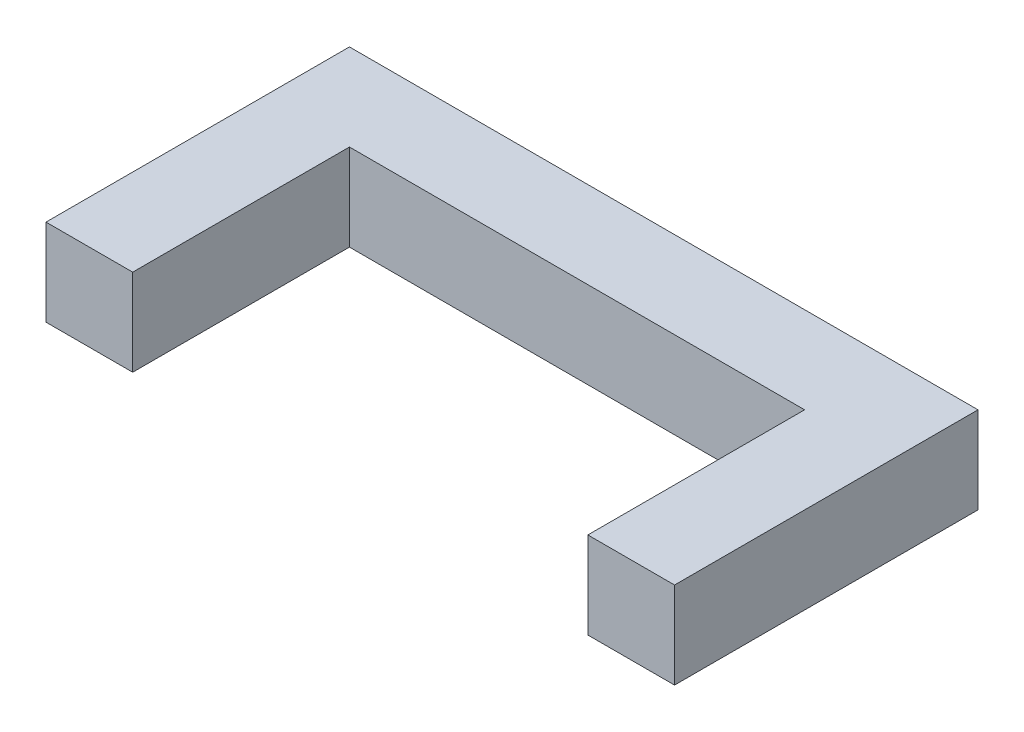
ISO-10303-21;
HEADER;
FILE_DESCRIPTION(('STEP AP214'),'2;1');
FILE_NAME('part.step','',(''),(''),'','','');
FILE_SCHEMA(('AUTOMOTIVE_DESIGN { 1 0 10303 214 1 1 1 1 }'));
ENDSEC;
DATA;
#1=APPLICATION_CONTEXT('core data for automotive mechanical design processes');
#2=APPLICATION_PROTOCOL_DEFINITION('international standard','automotive_design',2000,#1);
#3=PRODUCT_CONTEXT('',#1,'mechanical');
#4=PRODUCT('Part','Part','',(#3));
#5=PRODUCT_RELATED_PRODUCT_CATEGORY('part','',(#4));
#6=PRODUCT_DEFINITION_FORMATION('','',#4);
#7=PRODUCT_DEFINITION_CONTEXT('part definition',#1,'design');
#8=PRODUCT_DEFINITION('design','',#6,#7);
#9=PRODUCT_DEFINITION_SHAPE('','',#8);
#10=(LENGTH_UNIT() NAMED_UNIT(*) SI_UNIT(.MILLI.,.METRE.));
#11=(NAMED_UNIT(*) PLANE_ANGLE_UNIT() SI_UNIT($,.RADIAN.));
#12=(NAMED_UNIT(*) SI_UNIT($,.STERADIAN.) SOLID_ANGLE_UNIT());
#13=UNCERTAINTY_MEASURE_WITH_UNIT(LENGTH_MEASURE(1.E-05),#10,'distance_accuracy_value','');
#14=(GEOMETRIC_REPRESENTATION_CONTEXT(3) GLOBAL_UNCERTAINTY_ASSIGNED_CONTEXT((#13)) GLOBAL_UNIT_ASSIGNED_CONTEXT((#10,
#11,#12)) REPRESENTATION_CONTEXT('',''));
#15=CARTESIAN_POINT('',(0.,0.,0.));
#16=DIRECTION('',(0.,0.,1.));
#17=DIRECTION('',(1.,0.,0.));
#18=AXIS2_PLACEMENT_3D('',#15,#16,#17);
#19=CARTESIAN_POINT('',(0.,0.,-35.6));
#20=DIRECTION('',(0.,0.,-1.));
#21=DIRECTION('',(-1.,0.,0.));
#22=AXIS2_PLACEMENT_3D('',#19,#20,#21);
#23=PLANE('',#22);
#24=DIRECTION('',(-1.,0.,0.));
#25=VECTOR('',#24,1.);
#26=CARTESIAN_POINT('',(7.15964794267165,36.9181021954412,-35.6));
#27=LINE('',#26,#25);
#28=CARTESIAN_POINT('',(7.15964794267165,36.9181021954412,-35.6));
#29=VERTEX_POINT('',#28);
#30=CARTESIAN_POINT('',(5.15964794267165,36.9181021954412,-35.6));
#31=VERTEX_POINT('',#30);
#32=EDGE_CURVE('E156',#29,#31,#27,.T.);
#33=ORIENTED_EDGE('',*,*,#32,.F.);
#34=DIRECTION('',(0.,-1.,0.));
#35=VECTOR('',#34,1.);
#36=CARTESIAN_POINT('',(7.15964794267165,38.9181021954412,-35.6));
#37=LINE('',#36,#35);
#38=CARTESIAN_POINT('',(7.15964794267165,38.9181021954412,-35.6));
#39=VERTEX_POINT('',#38);
#40=EDGE_CURVE('E159',#39,#29,#37,.T.);
#41=ORIENTED_EDGE('',*,*,#40,.F.);
#42=DIRECTION('',(1.,0.,0.));
#43=VECTOR('',#42,1.);
#44=CARTESIAN_POINT('',(7.15964794267165,38.9181021954412,-35.6));
#45=LINE('',#44,#43);
#46=CARTESIAN_POINT('',(5.15964794267165,38.9181021954412,-35.6));
#47=VERTEX_POINT('',#46);
#48=EDGE_CURVE('E177',#47,#39,#45,.T.);
#49=ORIENTED_EDGE('',*,*,#48,.F.);
#50=DIRECTION('',(0.,1.,0.));
#51=VECTOR('',#50,1.);
#52=CARTESIAN_POINT('',(5.15964794267165,38.9181021954412,-35.6));
#53=LINE('',#52,#51);
#54=EDGE_CURVE('E161',#31,#47,#53,.T.);
#55=ORIENTED_EDGE('',*,*,#54,.F.);
#56=EDGE_LOOP('',(#33,#41,#49,#55));
#57=FACE_BOUND('',#56,.T.);
#58=ADVANCED_FACE('F35',(#57),#23,.F.);
#59=DIRECTION('',(-1.,0.,0.));
#60=VECTOR('',#59,1.);
#61=CARTESIAN_POINT('',(-5.34035205732835,36.9181021954412,-35.6));
#62=LINE('',#61,#60);
#63=CARTESIAN_POINT('',(-5.34035205732835,36.9181021954412,-35.6));
#64=VERTEX_POINT('',#63);
#65=CARTESIAN_POINT('',(-7.34035205732835,36.9181021954412,-35.6));
#66=VERTEX_POINT('',#65);
#67=EDGE_CURVE('E127',#64,#66,#62,.T.);
#68=ORIENTED_EDGE('',*,*,#67,.F.);
#69=DIRECTION('',(0.,-1.,0.));
#70=VECTOR('',#69,1.);
#71=CARTESIAN_POINT('',(-5.34035205732835,38.9181021954412,-35.6));
#72=LINE('',#71,#70);
#73=CARTESIAN_POINT('',(-5.34035205732835,38.9181021954412,-35.6));
#74=VERTEX_POINT('',#73);
#75=EDGE_CURVE('E108',#74,#64,#72,.T.);
#76=ORIENTED_EDGE('',*,*,#75,.F.);
#77=DIRECTION('',(1.,0.,0.));
#78=VECTOR('',#77,1.);
#79=CARTESIAN_POINT('',(-5.34035205732835,38.9181021954412,-35.6));
#80=LINE('',#79,#78);
#81=CARTESIAN_POINT('',(-7.34035205732835,38.9181021954412,-35.6));
#82=VERTEX_POINT('',#81);
#83=EDGE_CURVE('E43',#82,#74,#80,.T.);
#84=ORIENTED_EDGE('',*,*,#83,.F.);
#85=DIRECTION('',(0.,1.,0.));
#86=VECTOR('',#85,1.);
#87=CARTESIAN_POINT('',(-7.34035205732835,38.9181021954412,-35.6));
#88=LINE('',#87,#86);
#89=EDGE_CURVE('E12',#66,#82,#88,.T.);
#90=ORIENTED_EDGE('',*,*,#89,.F.);
#91=EDGE_LOOP('',(#68,#76,#84,#90));
#92=FACE_BOUND('',#91,.T.);
#93=ADVANCED_FACE('F37',(#92),#23,.F.);
#94=CARTESIAN_POINT('',(-7.34035205732835,38.9181021954412,-40.6));
#95=DIRECTION('',(0.,0.,-1.));
#96=DIRECTION('',(-1.,0.,0.));
#97=AXIS2_PLACEMENT_3D('',#94,#95,#96);
#98=PLANE('',#97);
#99=DIRECTION('',(0.,1.,0.));
#100=VECTOR('',#99,1.);
#101=CARTESIAN_POINT('',(-5.34035205732835,38.9181021954412,-40.6));
#102=LINE('',#101,#100);
#103=CARTESIAN_POINT('',(-5.34035205732835,36.9181021954412,-40.6));
#104=VERTEX_POINT('',#103);
#105=CARTESIAN_POINT('',(-5.34035205732835,38.9181021954412,-40.6));
#106=VERTEX_POINT('',#105);
#107=EDGE_CURVE('E189',#104,#106,#102,.T.);
#108=ORIENTED_EDGE('',*,*,#107,.F.);
#109=DIRECTION('',(1.,0.,0.));
#110=VECTOR('',#109,1.);
#111=CARTESIAN_POINT('',(-7.34035205732835,36.9181021954412,-40.6));
#112=LINE('',#111,#110);
#113=CARTESIAN_POINT('',(5.15964794267165,36.9181021954412,-40.6));
#114=VERTEX_POINT('',#113);
#115=EDGE_CURVE('E56',#104,#114,#112,.T.);
#116=ORIENTED_EDGE('',*,*,#115,.T.);
#117=DIRECTION('',(0.,1.,0.));
#118=VECTOR('',#117,1.);
#119=CARTESIAN_POINT('',(5.15964794267165,38.9181021954412,-40.6));
#120=LINE('',#119,#118);
#121=CARTESIAN_POINT('',(5.15964794267165,38.9181021954412,-40.6));
#122=VERTEX_POINT('',#121);
#123=EDGE_CURVE('E115',#114,#122,#120,.T.);
#124=ORIENTED_EDGE('',*,*,#123,.T.);
#125=DIRECTION('',(1.,0.,0.));
#126=VECTOR('',#125,1.);
#127=CARTESIAN_POINT('',(-7.34035205732835,38.9181021954412,-40.6));
#128=LINE('',#127,#126);
#129=EDGE_CURVE('E180',#106,#122,#128,.T.);
#130=ORIENTED_EDGE('',*,*,#129,.F.);
#131=EDGE_LOOP('',(#108,#116,#124,#130));
#132=FACE_BOUND('',#131,.T.);
#133=ADVANCED_FACE('F152',(#132),#98,.F.);
#134=CARTESIAN_POINT('',(5.15964794267165,38.9181021954412,-42.6));
#135=DIRECTION('',(1.,0.,0.));
#136=DIRECTION('',(0.,0.,-1.));
#137=AXIS2_PLACEMENT_3D('',#134,#135,#136);
#138=PLANE('',#137);
#139=ORIENTED_EDGE('',*,*,#123,.F.);
#140=DIRECTION('',(0.,0.,1.));
#141=VECTOR('',#140,1.);
#142=CARTESIAN_POINT('',(5.15964794267165,36.9181021954412,-42.6));
#143=LINE('',#142,#141);
#144=EDGE_CURVE('E168',#114,#31,#143,.T.);
#145=ORIENTED_EDGE('',*,*,#144,.T.);
#146=ORIENTED_EDGE('',*,*,#54,.T.);
#147=DIRECTION('',(0.,0.,1.));
#148=VECTOR('',#147,1.);
#149=CARTESIAN_POINT('',(5.15964794267165,38.9181021954412,-42.6));
#150=LINE('',#149,#148);
#151=EDGE_CURVE('E172',#122,#47,#150,.T.);
#152=ORIENTED_EDGE('',*,*,#151,.F.);
#153=EDGE_LOOP('',(#139,#145,#146,#152));
#154=FACE_BOUND('',#153,.T.);
#155=ADVANCED_FACE('F191',(#154),#138,.F.);
#156=CARTESIAN_POINT('',(7.15964794267165,38.9181021954412,-42.6));
#157=DIRECTION('',(0.,-1.,0.));
#158=DIRECTION('',(0.,0.,-1.));
#159=AXIS2_PLACEMENT_3D('',#156,#157,#158);
#160=PLANE('',#159);
#161=DIRECTION('',(0.,0.,-1.));
#162=VECTOR('',#161,1.);
#163=CARTESIAN_POINT('',(-7.34035205732835,38.9181021954412,-42.6));
#164=LINE('',#163,#162);
#165=CARTESIAN_POINT('',(-7.34035205732835,38.9181021954412,-42.6));
#166=VERTEX_POINT('',#165);
#167=EDGE_CURVE('E103',#82,#166,#164,.T.);
#168=ORIENTED_EDGE('',*,*,#167,.F.);
#169=ORIENTED_EDGE('',*,*,#83,.T.);
#170=DIRECTION('',(0.,0.,1.));
#171=VECTOR('',#170,1.);
#172=CARTESIAN_POINT('',(-5.34035205732835,38.9181021954412,-42.6));
#173=LINE('',#172,#171);
#174=EDGE_CURVE('E119',#106,#74,#173,.T.);
#175=ORIENTED_EDGE('',*,*,#174,.F.);
#176=ORIENTED_EDGE('',*,*,#129,.T.);
#177=ORIENTED_EDGE('',*,*,#151,.T.);
#178=ORIENTED_EDGE('',*,*,#48,.T.);
#179=DIRECTION('',(0.,0.,1.));
#180=VECTOR('',#179,1.);
#181=CARTESIAN_POINT('',(7.15964794267165,38.9181021954412,-42.6));
#182=LINE('',#181,#180);
#183=CARTESIAN_POINT('',(7.15964794267165,38.9181021954412,-42.6));
#184=VERTEX_POINT('',#183);
#185=EDGE_CURVE('E169',#184,#39,#182,.T.);
#186=ORIENTED_EDGE('',*,*,#185,.F.);
#187=DIRECTION('',(1.,0.,0.));
#188=VECTOR('',#187,1.);
#189=CARTESIAN_POINT('',(7.15964794267165,38.9181021954412,-42.6));
#190=LINE('',#189,#188);
#191=EDGE_CURVE('E114',#166,#184,#190,.T.);
#192=ORIENTED_EDGE('',*,*,#191,.F.);
#193=EDGE_LOOP('',(#168,#169,#175,#176,#177,#178,#186,#192));
#194=FACE_BOUND('',#193,.T.);
#195=ADVANCED_FACE('F112',(#194),#160,.F.);
#196=CARTESIAN_POINT('',(7.15964794267165,38.9181021954412,-42.6));
#197=DIRECTION('',(-1.,0.,0.));
#198=DIRECTION('',(0.,0.,1.));
#199=AXIS2_PLACEMENT_3D('',#196,#197,#198);
#200=PLANE('',#199);
#201=ORIENTED_EDGE('',*,*,#40,.T.);
#202=DIRECTION('',(0.,0.,1.));
#203=VECTOR('',#202,1.);
#204=CARTESIAN_POINT('',(7.15964794267165,36.9181021954412,-42.6));
#205=LINE('',#204,#203);
#206=CARTESIAN_POINT('',(7.15964794267165,36.9181021954412,-42.6));
#207=VERTEX_POINT('',#206);
#208=EDGE_CURVE('E165',#207,#29,#205,.T.);
#209=ORIENTED_EDGE('',*,*,#208,.F.);
#210=DIRECTION('',(0.,-1.,0.));
#211=VECTOR('',#210,1.);
#212=CARTESIAN_POINT('',(7.15964794267165,38.9181021954412,-42.6));
#213=LINE('',#212,#211);
#214=EDGE_CURVE('E182',#184,#207,#213,.T.);
#215=ORIENTED_EDGE('',*,*,#214,.F.);
#216=ORIENTED_EDGE('',*,*,#185,.T.);
#217=EDGE_LOOP('',(#201,#209,#215,#216));
#218=FACE_BOUND('',#217,.T.);
#219=ADVANCED_FACE('F137',(#218),#200,.F.);
#220=CARTESIAN_POINT('',(7.15964794267165,36.9181021954412,-42.6));
#221=DIRECTION('',(0.,1.,0.));
#222=DIRECTION('',(0.,0.,1.));
#223=AXIS2_PLACEMENT_3D('',#220,#221,#222);
#224=PLANE('',#223);
#225=DIRECTION('',(0.,0.,1.));
#226=VECTOR('',#225,1.);
#227=CARTESIAN_POINT('',(-7.34035205732835,36.9181021954412,-42.6));
#228=LINE('',#227,#226);
#229=CARTESIAN_POINT('',(-7.34035205732835,36.9181021954412,-42.6));
#230=VERTEX_POINT('',#229);
#231=EDGE_CURVE('E106',#230,#66,#228,.T.);
#232=ORIENTED_EDGE('',*,*,#231,.F.);
#233=DIRECTION('',(-1.,0.,0.));
#234=VECTOR('',#233,1.);
#235=CARTESIAN_POINT('',(7.15964794267165,36.9181021954412,-42.6));
#236=LINE('',#235,#234);
#237=EDGE_CURVE('E166',#207,#230,#236,.T.);
#238=ORIENTED_EDGE('',*,*,#237,.F.);
#239=ORIENTED_EDGE('',*,*,#208,.T.);
#240=ORIENTED_EDGE('',*,*,#32,.T.);
#241=ORIENTED_EDGE('',*,*,#144,.F.);
#242=ORIENTED_EDGE('',*,*,#115,.F.);
#243=DIRECTION('',(0.,0.,1.));
#244=VECTOR('',#243,1.);
#245=CARTESIAN_POINT('',(-5.34035205732835,36.9181021954412,-42.6));
#246=LINE('',#245,#244);
#247=EDGE_CURVE('E125',#104,#64,#246,.T.);
#248=ORIENTED_EDGE('',*,*,#247,.T.);
#249=ORIENTED_EDGE('',*,*,#67,.T.);
#250=EDGE_LOOP('',(#232,#238,#239,#240,#241,#242,#248,#249));
#251=FACE_BOUND('',#250,.T.);
#252=ADVANCED_FACE('F133',(#251),#224,.F.);
#253=CARTESIAN_POINT('',(0.,0.,-42.6));
#254=DIRECTION('',(0.,0.,-1.));
#255=DIRECTION('',(-1.,0.,0.));
#256=AXIS2_PLACEMENT_3D('',#253,#254,#255);
#257=PLANE('',#256);
#258=ORIENTED_EDGE('',*,*,#191,.T.);
#259=ORIENTED_EDGE('',*,*,#214,.T.);
#260=ORIENTED_EDGE('',*,*,#237,.T.);
#261=DIRECTION('',(0.,-1.,0.));
#262=VECTOR('',#261,1.);
#263=CARTESIAN_POINT('',(-7.34035205732835,38.9181021954412,-42.6));
#264=LINE('',#263,#262);
#265=EDGE_CURVE('E116',#166,#230,#264,.T.);
#266=ORIENTED_EDGE('',*,*,#265,.F.);
#267=EDGE_LOOP('',(#258,#259,#260,#266));
#268=FACE_BOUND('',#267,.T.);
#269=ADVANCED_FACE('F136',(#268),#257,.T.);
#270=CARTESIAN_POINT('',(-7.34035205732835,0.,0.));
#271=DIRECTION('',(-1.,0.,0.));
#272=DIRECTION('',(0.,0.,1.));
#273=AXIS2_PLACEMENT_3D('',#270,#271,#272);
#274=PLANE('',#273);
#275=ORIENTED_EDGE('',*,*,#231,.T.);
#276=ORIENTED_EDGE('',*,*,#89,.T.);
#277=ORIENTED_EDGE('',*,*,#167,.T.);
#278=ORIENTED_EDGE('',*,*,#265,.T.);
#279=EDGE_LOOP('',(#275,#276,#277,#278));
#280=FACE_BOUND('',#279,.T.);
#281=ADVANCED_FACE('F100',(#280),#274,.T.);
#282=CARTESIAN_POINT('',(-5.34035205732835,38.9181021954412,-42.6));
#283=DIRECTION('',(-1.,0.,0.));
#284=DIRECTION('',(0.,0.,1.));
#285=AXIS2_PLACEMENT_3D('',#282,#283,#284);
#286=PLANE('',#285);
#287=ORIENTED_EDGE('',*,*,#247,.F.);
#288=ORIENTED_EDGE('',*,*,#107,.T.);
#289=ORIENTED_EDGE('',*,*,#174,.T.);
#290=ORIENTED_EDGE('',*,*,#75,.T.);
#291=EDGE_LOOP('',(#287,#288,#289,#290));
#292=FACE_BOUND('',#291,.T.);
#293=ADVANCED_FACE('F131',(#292),#286,.F.);
#294=CLOSED_SHELL('',(#58,#93,#133,#155,#195,#219,#252,#269,#281,#293));
#295=MANIFOLD_SOLID_BREP('B2',#294);
#296=ADVANCED_BREP_SHAPE_REPRESENTATION('',(#18,#295),#14);
#297=SHAPE_DEFINITION_REPRESENTATION(#9,#296);
ENDSEC;
END-ISO-10303-21;
